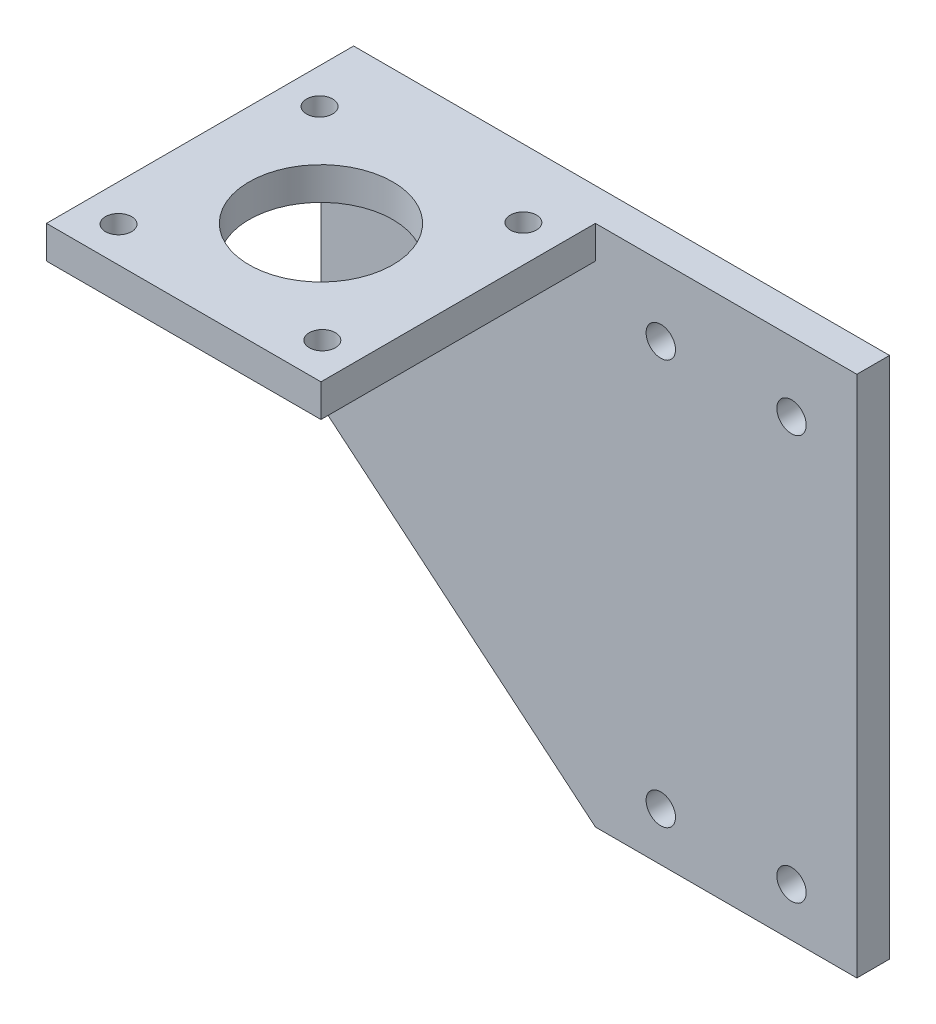
ISO-10303-21;
HEADER;
FILE_DESCRIPTION(('STEP AP214'),'2;1');
FILE_NAME('part.step','',(''),(''),'','','');
FILE_SCHEMA(('AUTOMOTIVE_DESIGN { 1 0 10303 214 1 1 1 1 }'));
ENDSEC;
DATA;
#1=APPLICATION_CONTEXT('core data for automotive mechanical design processes');
#2=APPLICATION_PROTOCOL_DEFINITION('international standard','automotive_design',2000,#1);
#3=PRODUCT_CONTEXT('',#1,'mechanical');
#4=PRODUCT('Part','Part','',(#3));
#5=PRODUCT_RELATED_PRODUCT_CATEGORY('part','',(#4));
#6=PRODUCT_DEFINITION_FORMATION('','',#4);
#7=PRODUCT_DEFINITION_CONTEXT('part definition',#1,'design');
#8=PRODUCT_DEFINITION('design','',#6,#7);
#9=PRODUCT_DEFINITION_SHAPE('','',#8);
#10=(LENGTH_UNIT() NAMED_UNIT(*) SI_UNIT(.MILLI.,.METRE.));
#11=(NAMED_UNIT(*) PLANE_ANGLE_UNIT() SI_UNIT($,.RADIAN.));
#12=(NAMED_UNIT(*) SI_UNIT($,.STERADIAN.) SOLID_ANGLE_UNIT());
#13=UNCERTAINTY_MEASURE_WITH_UNIT(LENGTH_MEASURE(1.E-05),#10,'distance_accuracy_value','');
#14=(GEOMETRIC_REPRESENTATION_CONTEXT(3) GLOBAL_UNCERTAINTY_ASSIGNED_CONTEXT((#13)) GLOBAL_UNIT_ASSIGNED_CONTEXT((#10,
#11,#12)) REPRESENTATION_CONTEXT('',''));
#15=CARTESIAN_POINT('',(0.,0.,0.));
#16=DIRECTION('',(0.,0.,1.));
#17=DIRECTION('',(1.,0.,0.));
#18=AXIS2_PLACEMENT_3D('',#15,#16,#17);
#19=CARTESIAN_POINT('',(0.,5.,-42.));
#20=DIRECTION('',(0.,-1.,0.));
#21=DIRECTION('',(0.,0.,1.));
#22=AXIS2_PLACEMENT_3D('',#19,#20,#21);
#23=PLANE('',#22);
#24=DIRECTION('',(0.,0.,1.));
#25=VECTOR('',#24,1.);
#26=CARTESIAN_POINT('',(21.,5.,-63.));
#27=LINE('',#26,#25);
#28=CARTESIAN_POINT('',(21.,5.,-63.));
#29=VERTEX_POINT('',#28);
#30=CARTESIAN_POINT('',(21.,5.,-21.));
#31=VERTEX_POINT('',#30);
#32=EDGE_CURVE('E91',#29,#31,#27,.T.);
#33=ORIENTED_EDGE('',*,*,#32,.F.);
#34=DIRECTION('',(-1.,0.,0.));
#35=VECTOR('',#34,1.);
#36=CARTESIAN_POINT('',(21.,5.,-63.));
#37=LINE('',#36,#35);
#38=CARTESIAN_POINT('',(61.,5.,-63.));
#39=VERTEX_POINT('',#38);
#40=EDGE_CURVE('E77',#39,#29,#37,.T.);
#41=ORIENTED_EDGE('',*,*,#40,.F.);
#42=DIRECTION('',(0.,0.,1.));
#43=VECTOR('',#42,1.);
#44=CARTESIAN_POINT('',(61.,5.,-68.));
#45=LINE('',#44,#43);
#46=CARTESIAN_POINT('',(61.,5.,-68.));
#47=VERTEX_POINT('',#46);
#48=EDGE_CURVE('E141',#47,#39,#45,.T.);
#49=ORIENTED_EDGE('',*,*,#48,.F.);
#50=DIRECTION('',(-1.,0.,0.));
#51=VECTOR('',#50,1.);
#52=CARTESIAN_POINT('',(-21.,5.,-68.));
#53=LINE('',#52,#51);
#54=CARTESIAN_POINT('',(-21.,5.,-68.));
#55=VERTEX_POINT('',#54);
#56=EDGE_CURVE('E146',#47,#55,#53,.T.);
#57=ORIENTED_EDGE('',*,*,#56,.T.);
#58=DIRECTION('',(0.,0.,-1.));
#59=VECTOR('',#58,1.);
#60=CARTESIAN_POINT('',(-21.,5.,-63.));
#61=LINE('',#60,#59);
#62=CARTESIAN_POINT('',(-21.,5.,-21.));
#63=VERTEX_POINT('',#62);
#64=EDGE_CURVE('E82',#63,#55,#61,.T.);
#65=ORIENTED_EDGE('',*,*,#64,.F.);
#66=DIRECTION('',(-1.,0.,0.));
#67=VECTOR('',#66,1.);
#68=CARTESIAN_POINT('',(-21.,5.,-21.));
#69=LINE('',#68,#67);
#70=EDGE_CURVE('E103',#31,#63,#69,.T.);
#71=ORIENTED_EDGE('',*,*,#70,.F.);
#72=EDGE_LOOP('',(#33,#41,#49,#57,#65,#71));
#73=FACE_BOUND('',#72,.T.);
#74=CARTESIAN_POINT('',(0.,5.,-42.));
#75=DIRECTION('',(0.,-1.,0.));
#76=DIRECTION('',(0.,0.,-1.));
#77=AXIS2_PLACEMENT_3D('',#74,#75,#76);
#78=CIRCLE('',#77,11.);
#79=CARTESIAN_POINT('',(0.,5.,-53.));
#80=VERTEX_POINT('',#79);
#81=EDGE_CURVE('E94',#80,#80,#78,.T.);
#82=ORIENTED_EDGE('',*,*,#81,.T.);
#83=EDGE_LOOP('',(#82));
#84=FACE_BOUND('',#83,.T.);
#85=CARTESIAN_POINT('',(-15.592519129157,5.,-57.3780150606921));
#86=DIRECTION('',(0.,-1.,0.));
#87=DIRECTION('',(0.,0.,-1.));
#88=AXIS2_PLACEMENT_3D('',#85,#86,#87);
#89=CIRCLE('',#88,2.);
#90=CARTESIAN_POINT('',(-15.592519129157,5.,-59.3780150606921));
#91=VERTEX_POINT('',#90);
#92=EDGE_CURVE('E107',#91,#91,#89,.T.);
#93=ORIENTED_EDGE('',*,*,#92,.T.);
#94=EDGE_LOOP('',(#93));
#95=FACE_BOUND('',#94,.T.);
#96=CARTESIAN_POINT('',(-15.3780150606921,5.,-26.407480870843));
#97=DIRECTION('',(0.,-1.,0.));
#98=DIRECTION('',(0.,0.,-1.));
#99=AXIS2_PLACEMENT_3D('',#96,#97,#98);
#100=CIRCLE('',#99,2.);
#101=CARTESIAN_POINT('',(-15.3780150606921,5.,-28.407480870843));
#102=VERTEX_POINT('',#101);
#103=EDGE_CURVE('E112',#102,#102,#100,.T.);
#104=ORIENTED_EDGE('',*,*,#103,.T.);
#105=EDGE_LOOP('',(#104));
#106=FACE_BOUND('',#105,.T.);
#107=CARTESIAN_POINT('',(15.592519129157,5.,-26.6219849393079));
#108=DIRECTION('',(0.,-1.,0.));
#109=DIRECTION('',(0.,0.,-1.));
#110=AXIS2_PLACEMENT_3D('',#107,#108,#109);
#111=CIRCLE('',#110,2.);
#112=CARTESIAN_POINT('',(15.592519129157,5.,-28.6219849393079));
#113=VERTEX_POINT('',#112);
#114=EDGE_CURVE('E118',#113,#113,#111,.T.);
#115=ORIENTED_EDGE('',*,*,#114,.T.);
#116=EDGE_LOOP('',(#115));
#117=FACE_BOUND('',#116,.T.);
#118=CARTESIAN_POINT('',(15.3780150606921,5.,-57.592519129157));
#119=DIRECTION('',(0.,-1.,0.));
#120=DIRECTION('',(0.,0.,-1.));
#121=AXIS2_PLACEMENT_3D('',#118,#119,#120);
#122=CIRCLE('',#121,2.);
#123=CARTESIAN_POINT('',(15.3780150606921,5.,-59.592519129157));
#124=VERTEX_POINT('',#123);
#125=EDGE_CURVE('E124',#124,#124,#122,.T.);
#126=ORIENTED_EDGE('',*,*,#125,.T.);
#127=EDGE_LOOP('',(#126));
#128=FACE_BOUND('',#127,.T.);
#129=ADVANCED_FACE('F35',(#73,#84,#95,#106,#117,#128),#23,.F.);
#130=CARTESIAN_POINT('',(0.,0.,-42.));
#131=DIRECTION('',(0.,-1.,0.));
#132=DIRECTION('',(0.,0.,1.));
#133=AXIS2_PLACEMENT_3D('',#130,#131,#132);
#134=PLANE('',#133);
#135=CARTESIAN_POINT('',(15.592519129157,0.,-26.6219849393079));
#136=DIRECTION('',(0.,-1.,0.));
#137=DIRECTION('',(0.,0.,-1.));
#138=AXIS2_PLACEMENT_3D('',#135,#136,#137);
#139=CIRCLE('',#138,2.);
#140=CARTESIAN_POINT('',(15.592519129157,0.,-28.6219849393079));
#141=VERTEX_POINT('',#140);
#142=EDGE_CURVE('E121',#141,#141,#139,.T.);
#143=ORIENTED_EDGE('',*,*,#142,.F.);
#144=EDGE_LOOP('',(#143));
#145=FACE_BOUND('',#144,.T.);
#146=CARTESIAN_POINT('',(-15.592519129157,0.,-57.3780150606921));
#147=DIRECTION('',(0.,-1.,0.));
#148=DIRECTION('',(0.,0.,-1.));
#149=AXIS2_PLACEMENT_3D('',#146,#147,#148);
#150=CIRCLE('',#149,2.);
#151=CARTESIAN_POINT('',(-15.592519129157,0.,-59.3780150606921));
#152=VERTEX_POINT('',#151);
#153=EDGE_CURVE('E109',#152,#152,#150,.T.);
#154=ORIENTED_EDGE('',*,*,#153,.F.);
#155=EDGE_LOOP('',(#154));
#156=FACE_BOUND('',#155,.T.);
#157=DIRECTION('',(0.,0.,1.));
#158=VECTOR('',#157,1.);
#159=CARTESIAN_POINT('',(21.,0.,-63.));
#160=LINE('',#159,#158);
#161=CARTESIAN_POINT('',(21.,0.,-63.));
#162=VERTEX_POINT('',#161);
#163=CARTESIAN_POINT('',(21.,0.,-21.));
#164=VERTEX_POINT('',#163);
#165=EDGE_CURVE('E89',#162,#164,#160,.T.);
#166=ORIENTED_EDGE('',*,*,#165,.T.);
#167=DIRECTION('',(-1.,0.,0.));
#168=VECTOR('',#167,1.);
#169=CARTESIAN_POINT('',(-21.,0.,-21.));
#170=LINE('',#169,#168);
#171=CARTESIAN_POINT('',(-21.,0.,-21.));
#172=VERTEX_POINT('',#171);
#173=EDGE_CURVE('E93',#164,#172,#170,.T.);
#174=ORIENTED_EDGE('',*,*,#173,.T.);
#175=DIRECTION('',(0.,0.,-1.));
#176=VECTOR('',#175,1.);
#177=CARTESIAN_POINT('',(-21.,0.,-63.));
#178=LINE('',#177,#176);
#179=CARTESIAN_POINT('',(-21.,0.,-63.));
#180=VERTEX_POINT('',#179);
#181=EDGE_CURVE('E90',#172,#180,#178,.T.);
#182=ORIENTED_EDGE('',*,*,#181,.T.);
#183=DIRECTION('',(1.,0.,0.));
#184=VECTOR('',#183,1.);
#185=CARTESIAN_POINT('',(-21.,0.,-63.));
#186=LINE('',#185,#184);
#187=EDGE_CURVE('E73',#180,#162,#186,.T.);
#188=ORIENTED_EDGE('',*,*,#187,.T.);
#189=EDGE_LOOP('',(#166,#174,#182,#188));
#190=FACE_BOUND('',#189,.T.);
#191=CARTESIAN_POINT('',(0.,0.,-42.));
#192=DIRECTION('',(0.,-1.,0.));
#193=DIRECTION('',(0.,0.,-1.));
#194=AXIS2_PLACEMENT_3D('',#191,#192,#193);
#195=CIRCLE('',#194,11.);
#196=CARTESIAN_POINT('',(0.,0.,-53.));
#197=VERTEX_POINT('',#196);
#198=EDGE_CURVE('E98',#197,#197,#195,.T.);
#199=ORIENTED_EDGE('',*,*,#198,.F.);
#200=EDGE_LOOP('',(#199));
#201=FACE_BOUND('',#200,.T.);
#202=CARTESIAN_POINT('',(-15.3780150606921,0.,-26.407480870843));
#203=DIRECTION('',(0.,-1.,0.));
#204=DIRECTION('',(0.,0.,-1.));
#205=AXIS2_PLACEMENT_3D('',#202,#203,#204);
#206=CIRCLE('',#205,2.);
#207=CARTESIAN_POINT('',(-15.3780150606921,0.,-28.407480870843));
#208=VERTEX_POINT('',#207);
#209=EDGE_CURVE('E115',#208,#208,#206,.T.);
#210=ORIENTED_EDGE('',*,*,#209,.F.);
#211=EDGE_LOOP('',(#210));
#212=FACE_BOUND('',#211,.T.);
#213=CARTESIAN_POINT('',(15.3780150606921,0.,-57.592519129157));
#214=DIRECTION('',(0.,-1.,0.));
#215=DIRECTION('',(0.,0.,-1.));
#216=AXIS2_PLACEMENT_3D('',#213,#214,#215);
#217=CIRCLE('',#216,2.);
#218=CARTESIAN_POINT('',(15.3780150606921,0.,-59.592519129157));
#219=VERTEX_POINT('',#218);
#220=EDGE_CURVE('E127',#219,#219,#217,.T.);
#221=ORIENTED_EDGE('',*,*,#220,.F.);
#222=EDGE_LOOP('',(#221));
#223=FACE_BOUND('',#222,.T.);
#224=ADVANCED_FACE('F86',(#145,#156,#190,#201,#212,#223),#134,.T.);
#225=CARTESIAN_POINT('',(21.,5.,-63.));
#226=DIRECTION('',(-1.,0.,0.));
#227=DIRECTION('',(0.,0.,-1.));
#228=AXIS2_PLACEMENT_3D('',#225,#226,#227);
#229=PLANE('',#228);
#230=ORIENTED_EDGE('',*,*,#165,.F.);
#231=DIRECTION('',(0.,-1.,0.));
#232=VECTOR('',#231,1.);
#233=CARTESIAN_POINT('',(21.,5.,-63.));
#234=LINE('',#233,#232);
#235=EDGE_CURVE('E67',#29,#162,#234,.T.);
#236=ORIENTED_EDGE('',*,*,#235,.F.);
#237=ORIENTED_EDGE('',*,*,#32,.T.);
#238=DIRECTION('',(0.,-1.,0.));
#239=VECTOR('',#238,1.);
#240=CARTESIAN_POINT('',(21.,5.,-21.));
#241=LINE('',#240,#239);
#242=EDGE_CURVE('E11',#31,#164,#241,.T.);
#243=ORIENTED_EDGE('',*,*,#242,.T.);
#244=EDGE_LOOP('',(#230,#236,#237,#243));
#245=FACE_BOUND('',#244,.T.);
#246=ADVANCED_FACE('F37',(#245),#229,.F.);
#247=CARTESIAN_POINT('',(-21.,5.,-21.));
#248=DIRECTION('',(0.,0.,-1.));
#249=DIRECTION('',(1.,0.,0.));
#250=AXIS2_PLACEMENT_3D('',#247,#248,#249);
#251=PLANE('',#250);
#252=ORIENTED_EDGE('',*,*,#173,.F.);
#253=ORIENTED_EDGE('',*,*,#242,.F.);
#254=ORIENTED_EDGE('',*,*,#70,.T.);
#255=DIRECTION('',(0.,-1.,0.));
#256=VECTOR('',#255,1.);
#257=CARTESIAN_POINT('',(-21.,5.,-21.));
#258=LINE('',#257,#256);
#259=EDGE_CURVE('E44',#63,#172,#258,.T.);
#260=ORIENTED_EDGE('',*,*,#259,.T.);
#261=EDGE_LOOP('',(#252,#253,#254,#260));
#262=FACE_BOUND('',#261,.T.);
#263=ADVANCED_FACE('F236',(#262),#251,.F.);
#264=CARTESIAN_POINT('',(-21.,5.,-63.));
#265=DIRECTION('',(1.,0.,0.));
#266=DIRECTION('',(0.,0.,1.));
#267=AXIS2_PLACEMENT_3D('',#264,#265,#266);
#268=PLANE('',#267);
#269=ORIENTED_EDGE('',*,*,#181,.F.);
#270=ORIENTED_EDGE('',*,*,#259,.F.);
#271=ORIENTED_EDGE('',*,*,#64,.T.);
#272=DIRECTION('',(0.,-1.,0.));
#273=VECTOR('',#272,1.);
#274=CARTESIAN_POINT('',(-21.,0.,-68.));
#275=LINE('',#274,#273);
#276=CARTESIAN_POINT('',(-21.,-40.,-68.));
#277=VERTEX_POINT('',#276);
#278=EDGE_CURVE('E166',#55,#277,#275,.T.);
#279=ORIENTED_EDGE('',*,*,#278,.T.);
#280=DIRECTION('',(0.,0.,1.));
#281=VECTOR('',#280,1.);
#282=CARTESIAN_POINT('',(-21.,-40.,-68.));
#283=LINE('',#282,#281);
#284=CARTESIAN_POINT('',(-21.,-40.,-63.));
#285=VERTEX_POINT('',#284);
#286=EDGE_CURVE('E130',#277,#285,#283,.T.);
#287=ORIENTED_EDGE('',*,*,#286,.T.);
#288=DIRECTION('',(0.,-1.,0.));
#289=VECTOR('',#288,1.);
#290=CARTESIAN_POINT('',(-21.,0.,-63.));
#291=LINE('',#290,#289);
#292=EDGE_CURVE('E155',#180,#285,#291,.T.);
#293=ORIENTED_EDGE('',*,*,#292,.F.);
#294=EDGE_LOOP('',(#269,#270,#271,#279,#287,#293));
#295=FACE_BOUND('',#294,.T.);
#296=ADVANCED_FACE('F234',(#295),#268,.F.);
#297=CARTESIAN_POINT('',(0.,5.,-42.));
#298=DIRECTION('',(0.,-1.,0.));
#299=DIRECTION('',(0.,0.,1.));
#300=AXIS2_PLACEMENT_3D('',#297,#298,#299);
#301=CYLINDRICAL_SURFACE('',#300,11.);
#302=ORIENTED_EDGE('',*,*,#81,.F.);
#303=EDGE_LOOP('',(#302));
#304=FACE_BOUND('',#303,.T.);
#305=ORIENTED_EDGE('',*,*,#198,.T.);
#306=EDGE_LOOP('',(#305));
#307=FACE_BOUND('',#306,.T.);
#308=ADVANCED_FACE('F231',(#304,#307),#301,.F.);
#309=CARTESIAN_POINT('',(-15.592519129157,5.,-57.3780150606921));
#310=DIRECTION('',(0.,-1.,0.));
#311=DIRECTION('',(0.,0.,1.));
#312=AXIS2_PLACEMENT_3D('',#309,#310,#311);
#313=CYLINDRICAL_SURFACE('',#312,2.);
#314=ORIENTED_EDGE('',*,*,#92,.F.);
#315=EDGE_LOOP('',(#314));
#316=FACE_BOUND('',#315,.T.);
#317=ORIENTED_EDGE('',*,*,#153,.T.);
#318=EDGE_LOOP('',(#317));
#319=FACE_BOUND('',#318,.T.);
#320=ADVANCED_FACE('F317',(#316,#319),#313,.F.);
#321=CARTESIAN_POINT('',(-15.3780150606921,5.,-26.407480870843));
#322=DIRECTION('',(0.,-1.,0.));
#323=DIRECTION('',(0.,0.,1.));
#324=AXIS2_PLACEMENT_3D('',#321,#322,#323);
#325=CYLINDRICAL_SURFACE('',#324,2.);
#326=ORIENTED_EDGE('',*,*,#103,.F.);
#327=EDGE_LOOP('',(#326));
#328=FACE_BOUND('',#327,.T.);
#329=ORIENTED_EDGE('',*,*,#209,.T.);
#330=EDGE_LOOP('',(#329));
#331=FACE_BOUND('',#330,.T.);
#332=ADVANCED_FACE('F314',(#328,#331),#325,.F.);
#333=CARTESIAN_POINT('',(15.592519129157,5.,-26.6219849393079));
#334=DIRECTION('',(0.,-1.,0.));
#335=DIRECTION('',(0.,0.,1.));
#336=AXIS2_PLACEMENT_3D('',#333,#334,#335);
#337=CYLINDRICAL_SURFACE('',#336,2.);
#338=ORIENTED_EDGE('',*,*,#114,.F.);
#339=EDGE_LOOP('',(#338));
#340=FACE_BOUND('',#339,.T.);
#341=ORIENTED_EDGE('',*,*,#142,.T.);
#342=EDGE_LOOP('',(#341));
#343=FACE_BOUND('',#342,.T.);
#344=ADVANCED_FACE('F310',(#340,#343),#337,.F.);
#345=CARTESIAN_POINT('',(15.3780150606921,5.,-57.592519129157));
#346=DIRECTION('',(0.,-1.,0.));
#347=DIRECTION('',(0.,0.,1.));
#348=AXIS2_PLACEMENT_3D('',#345,#346,#347);
#349=CYLINDRICAL_SURFACE('',#348,2.);
#350=ORIENTED_EDGE('',*,*,#125,.F.);
#351=EDGE_LOOP('',(#350));
#352=FACE_BOUND('',#351,.T.);
#353=ORIENTED_EDGE('',*,*,#220,.T.);
#354=EDGE_LOOP('',(#353));
#355=FACE_BOUND('',#354,.T.);
#356=ADVANCED_FACE('F215',(#352,#355),#349,.F.);
#357=CARTESIAN_POINT('',(0.,0.,-68.));
#358=DIRECTION('',(0.,0.,1.));
#359=DIRECTION('',(-1.,0.,0.));
#360=AXIS2_PLACEMENT_3D('',#357,#358,#359);
#361=PLANE('',#360);
#362=ORIENTED_EDGE('',*,*,#56,.F.);
#363=DIRECTION('',(0.,1.,0.));
#364=VECTOR('',#363,1.);
#365=CARTESIAN_POINT('',(61.,5.,-68.));
#366=LINE('',#365,#364);
#367=CARTESIAN_POINT('',(61.,-75.,-68.));
#368=VERTEX_POINT('',#367);
#369=EDGE_CURVE('E144',#368,#47,#366,.T.);
#370=ORIENTED_EDGE('',*,*,#369,.F.);
#371=DIRECTION('',(1.,0.,0.));
#372=VECTOR('',#371,1.);
#373=CARTESIAN_POINT('',(61.,-75.,-68.));
#374=LINE('',#373,#372);
#375=CARTESIAN_POINT('',(21.,-75.,-68.));
#376=VERTEX_POINT('',#375);
#377=EDGE_CURVE('E160',#376,#368,#374,.T.);
#378=ORIENTED_EDGE('',*,*,#377,.F.);
#379=DIRECTION('',(0.768221279597376,-0.64018439966448,0.));
#380=VECTOR('',#379,1.);
#381=CARTESIAN_POINT('',(-21.,-40.,-68.));
#382=LINE('',#381,#380);
#383=EDGE_CURVE('E163',#277,#376,#382,.T.);
#384=ORIENTED_EDGE('',*,*,#383,.F.);
#385=ORIENTED_EDGE('',*,*,#278,.F.);
#386=EDGE_LOOP('',(#362,#370,#378,#384,#385));
#387=FACE_BOUND('',#386,.T.);
#388=CARTESIAN_POINT('',(51.,-67.5818456079327,-68.));
#389=DIRECTION('',(0.,0.,1.));
#390=DIRECTION('',(1.,0.,0.));
#391=AXIS2_PLACEMENT_3D('',#388,#389,#390);
#392=CIRCLE('',#391,2.25);
#393=CARTESIAN_POINT('',(53.25,-67.5818456079327,-68.));
#394=VERTEX_POINT('',#393);
#395=EDGE_CURVE('E157',#394,#394,#392,.T.);
#396=ORIENTED_EDGE('',*,*,#395,.T.);
#397=EDGE_LOOP('',(#396));
#398=FACE_BOUND('',#397,.T.);
#399=CARTESIAN_POINT('',(31.,-67.5818456079327,-68.));
#400=DIRECTION('',(0.,0.,1.));
#401=DIRECTION('',(1.,0.,0.));
#402=AXIS2_PLACEMENT_3D('',#399,#400,#401);
#403=CIRCLE('',#402,2.25);
#404=CARTESIAN_POINT('',(33.25,-67.5818456079327,-68.));
#405=VERTEX_POINT('',#404);
#406=EDGE_CURVE('E174',#405,#405,#403,.T.);
#407=ORIENTED_EDGE('',*,*,#406,.T.);
#408=EDGE_LOOP('',(#407));
#409=FACE_BOUND('',#408,.T.);
#410=CARTESIAN_POINT('',(31.,-5.62734865596326,-68.));
#411=DIRECTION('',(0.,0.,1.));
#412=DIRECTION('',(1.,0.,0.));
#413=AXIS2_PLACEMENT_3D('',#410,#411,#412);
#414=CIRCLE('',#413,2.25);
#415=CARTESIAN_POINT('',(33.25,-5.62734865596326,-68.));
#416=VERTEX_POINT('',#415);
#417=EDGE_CURVE('E180',#416,#416,#414,.T.);
#418=ORIENTED_EDGE('',*,*,#417,.T.);
#419=EDGE_LOOP('',(#418));
#420=FACE_BOUND('',#419,.T.);
#421=CARTESIAN_POINT('',(51.,-5.62734865596326,-68.));
#422=DIRECTION('',(0.,0.,1.));
#423=DIRECTION('',(1.,0.,0.));
#424=AXIS2_PLACEMENT_3D('',#421,#422,#423);
#425=CIRCLE('',#424,2.25);
#426=CARTESIAN_POINT('',(53.25,-5.62734865596326,-68.));
#427=VERTEX_POINT('',#426);
#428=EDGE_CURVE('E186',#427,#427,#425,.T.);
#429=ORIENTED_EDGE('',*,*,#428,.T.);
#430=EDGE_LOOP('',(#429));
#431=FACE_BOUND('',#430,.T.);
#432=ADVANCED_FACE('F195',(#387,#398,#409,#420,#431),#361,.F.);
#433=CARTESIAN_POINT('',(0.,0.,-63.));
#434=DIRECTION('',(0.,0.,1.));
#435=DIRECTION('',(-1.,0.,0.));
#436=AXIS2_PLACEMENT_3D('',#433,#434,#435);
#437=PLANE('',#436);
#438=CARTESIAN_POINT('',(31.,-5.62734865596326,-63.));
#439=DIRECTION('',(0.,0.,1.));
#440=DIRECTION('',(1.,0.,0.));
#441=AXIS2_PLACEMENT_3D('',#438,#439,#440);
#442=CIRCLE('',#441,2.25);
#443=CARTESIAN_POINT('',(33.25,-5.62734865596326,-63.));
#444=VERTEX_POINT('',#443);
#445=EDGE_CURVE('E183',#444,#444,#442,.T.);
#446=ORIENTED_EDGE('',*,*,#445,.F.);
#447=EDGE_LOOP('',(#446));
#448=FACE_BOUND('',#447,.T.);
#449=CARTESIAN_POINT('',(51.,-67.5818456079327,-63.));
#450=DIRECTION('',(0.,0.,1.));
#451=DIRECTION('',(1.,0.,0.));
#452=AXIS2_PLACEMENT_3D('',#449,#450,#451);
#453=CIRCLE('',#452,2.25);
#454=CARTESIAN_POINT('',(53.25,-67.5818456079327,-63.));
#455=VERTEX_POINT('',#454);
#456=EDGE_CURVE('E171',#455,#455,#453,.T.);
#457=ORIENTED_EDGE('',*,*,#456,.F.);
#458=EDGE_LOOP('',(#457));
#459=FACE_BOUND('',#458,.T.);
#460=ORIENTED_EDGE('',*,*,#292,.T.);
#461=DIRECTION('',(0.768221279597376,-0.64018439966448,0.));
#462=VECTOR('',#461,1.);
#463=CARTESIAN_POINT('',(-21.,-40.,-63.));
#464=LINE('',#463,#462);
#465=CARTESIAN_POINT('',(21.,-75.,-63.));
#466=VERTEX_POINT('',#465);
#467=EDGE_CURVE('E152',#285,#466,#464,.T.);
#468=ORIENTED_EDGE('',*,*,#467,.T.);
#469=DIRECTION('',(1.,0.,0.));
#470=VECTOR('',#469,1.);
#471=CARTESIAN_POINT('',(61.,-75.,-63.));
#472=LINE('',#471,#470);
#473=CARTESIAN_POINT('',(61.,-75.,-63.));
#474=VERTEX_POINT('',#473);
#475=EDGE_CURVE('E149',#466,#474,#472,.T.);
#476=ORIENTED_EDGE('',*,*,#475,.T.);
#477=DIRECTION('',(0.,1.,0.));
#478=VECTOR('',#477,1.);
#479=CARTESIAN_POINT('',(61.,5.,-63.));
#480=LINE('',#479,#478);
#481=EDGE_CURVE('E147',#474,#39,#480,.T.);
#482=ORIENTED_EDGE('',*,*,#481,.T.);
#483=ORIENTED_EDGE('',*,*,#40,.T.);
#484=ORIENTED_EDGE('',*,*,#235,.T.);
#485=ORIENTED_EDGE('',*,*,#187,.F.);
#486=EDGE_LOOP('',(#460,#468,#476,#482,#483,#484,#485));
#487=FACE_BOUND('',#486,.T.);
#488=CARTESIAN_POINT('',(31.,-67.5818456079327,-63.));
#489=DIRECTION('',(0.,0.,1.));
#490=DIRECTION('',(1.,0.,0.));
#491=AXIS2_PLACEMENT_3D('',#488,#489,#490);
#492=CIRCLE('',#491,2.25);
#493=CARTESIAN_POINT('',(33.25,-67.5818456079327,-63.));
#494=VERTEX_POINT('',#493);
#495=EDGE_CURVE('E177',#494,#494,#492,.T.);
#496=ORIENTED_EDGE('',*,*,#495,.F.);
#497=EDGE_LOOP('',(#496));
#498=FACE_BOUND('',#497,.T.);
#499=CARTESIAN_POINT('',(51.,-5.62734865596326,-63.));
#500=DIRECTION('',(0.,0.,1.));
#501=DIRECTION('',(1.,0.,0.));
#502=AXIS2_PLACEMENT_3D('',#499,#500,#501);
#503=CIRCLE('',#502,2.25);
#504=CARTESIAN_POINT('',(53.25,-5.62734865596326,-63.));
#505=VERTEX_POINT('',#504);
#506=EDGE_CURVE('E189',#505,#505,#503,.T.);
#507=ORIENTED_EDGE('',*,*,#506,.F.);
#508=EDGE_LOOP('',(#507));
#509=FACE_BOUND('',#508,.T.);
#510=ADVANCED_FACE('F70',(#448,#459,#487,#498,#509),#437,.T.);
#511=CARTESIAN_POINT('',(-21.,-40.,-68.));
#512=DIRECTION('',(0.64018439966448,0.768221279597376,0.));
#513=DIRECTION('',(-0.768221279597376,0.64018439966448,0.));
#514=AXIS2_PLACEMENT_3D('',#511,#512,#513);
#515=PLANE('',#514);
#516=ORIENTED_EDGE('',*,*,#467,.F.);
#517=ORIENTED_EDGE('',*,*,#286,.F.);
#518=ORIENTED_EDGE('',*,*,#383,.T.);
#519=DIRECTION('',(0.,0.,1.));
#520=VECTOR('',#519,1.);
#521=CARTESIAN_POINT('',(21.,-75.,-68.));
#522=LINE('',#521,#520);
#523=EDGE_CURVE('E135',#376,#466,#522,.T.);
#524=ORIENTED_EDGE('',*,*,#523,.T.);
#525=EDGE_LOOP('',(#516,#517,#518,#524));
#526=FACE_BOUND('',#525,.T.);
#527=ADVANCED_FACE('F205',(#526),#515,.F.);
#528=CARTESIAN_POINT('',(61.,-75.,-68.));
#529=DIRECTION('',(0.,1.,0.));
#530=DIRECTION('',(-1.,0.,0.));
#531=AXIS2_PLACEMENT_3D('',#528,#529,#530);
#532=PLANE('',#531);
#533=ORIENTED_EDGE('',*,*,#475,.F.);
#534=ORIENTED_EDGE('',*,*,#523,.F.);
#535=ORIENTED_EDGE('',*,*,#377,.T.);
#536=DIRECTION('',(0.,0.,1.));
#537=VECTOR('',#536,1.);
#538=CARTESIAN_POINT('',(61.,-75.,-68.));
#539=LINE('',#538,#537);
#540=EDGE_CURVE('E138',#368,#474,#539,.T.);
#541=ORIENTED_EDGE('',*,*,#540,.T.);
#542=EDGE_LOOP('',(#533,#534,#535,#541));
#543=FACE_BOUND('',#542,.T.);
#544=ADVANCED_FACE('F212',(#543),#532,.F.);
#545=CARTESIAN_POINT('',(61.,5.,-68.));
#546=DIRECTION('',(-1.,0.,0.));
#547=DIRECTION('',(0.,-1.,0.));
#548=AXIS2_PLACEMENT_3D('',#545,#546,#547);
#549=PLANE('',#548);
#550=ORIENTED_EDGE('',*,*,#481,.F.);
#551=ORIENTED_EDGE('',*,*,#540,.F.);
#552=ORIENTED_EDGE('',*,*,#369,.T.);
#553=ORIENTED_EDGE('',*,*,#48,.T.);
#554=EDGE_LOOP('',(#550,#551,#552,#553));
#555=FACE_BOUND('',#554,.T.);
#556=ADVANCED_FACE('F277',(#555),#549,.F.);
#557=CARTESIAN_POINT('',(51.,-67.5818456079327,-68.));
#558=DIRECTION('',(0.,0.,1.));
#559=DIRECTION('',(-1.,0.,0.));
#560=AXIS2_PLACEMENT_3D('',#557,#558,#559);
#561=CYLINDRICAL_SURFACE('',#560,2.25);
#562=ORIENTED_EDGE('',*,*,#395,.F.);
#563=EDGE_LOOP('',(#562));
#564=FACE_BOUND('',#563,.T.);
#565=ORIENTED_EDGE('',*,*,#456,.T.);
#566=EDGE_LOOP('',(#565));
#567=FACE_BOUND('',#566,.T.);
#568=ADVANCED_FACE('F292',(#564,#567),#561,.F.);
#569=CARTESIAN_POINT('',(31.,-67.5818456079327,-68.));
#570=DIRECTION('',(0.,0.,1.));
#571=DIRECTION('',(-1.,0.,0.));
#572=AXIS2_PLACEMENT_3D('',#569,#570,#571);
#573=CYLINDRICAL_SURFACE('',#572,2.25);
#574=ORIENTED_EDGE('',*,*,#406,.F.);
#575=EDGE_LOOP('',(#574));
#576=FACE_BOUND('',#575,.T.);
#577=ORIENTED_EDGE('',*,*,#495,.T.);
#578=EDGE_LOOP('',(#577));
#579=FACE_BOUND('',#578,.T.);
#580=ADVANCED_FACE('F287',(#576,#579),#573,.F.);
#581=CARTESIAN_POINT('',(31.,-5.62734865596326,-68.));
#582=DIRECTION('',(0.,0.,1.));
#583=DIRECTION('',(-1.,0.,0.));
#584=AXIS2_PLACEMENT_3D('',#581,#582,#583);
#585=CYLINDRICAL_SURFACE('',#584,2.25);
#586=ORIENTED_EDGE('',*,*,#417,.F.);
#587=EDGE_LOOP('',(#586));
#588=FACE_BOUND('',#587,.T.);
#589=ORIENTED_EDGE('',*,*,#445,.T.);
#590=EDGE_LOOP('',(#589));
#591=FACE_BOUND('',#590,.T.);
#592=ADVANCED_FACE('F200',(#588,#591),#585,.F.);
#593=CARTESIAN_POINT('',(51.,-5.62734865596326,-68.));
#594=DIRECTION('',(0.,0.,1.));
#595=DIRECTION('',(-1.,0.,0.));
#596=AXIS2_PLACEMENT_3D('',#593,#594,#595);
#597=CYLINDRICAL_SURFACE('',#596,2.25);
#598=ORIENTED_EDGE('',*,*,#428,.F.);
#599=EDGE_LOOP('',(#598));
#600=FACE_BOUND('',#599,.T.);
#601=ORIENTED_EDGE('',*,*,#506,.T.);
#602=EDGE_LOOP('',(#601));
#603=FACE_BOUND('',#602,.T.);
#604=ADVANCED_FACE('F197',(#600,#603),#597,.F.);
#605=CLOSED_SHELL('',(#129,#224,#246,#263,#296,#308,#320,#332,#344,#356,#432,#510,#527,#544,
#556,#568,#580,#592,#604));
#606=MANIFOLD_SOLID_BREP('B2',#605);
#607=ADVANCED_BREP_SHAPE_REPRESENTATION('',(#18,#606),#14);
#608=SHAPE_DEFINITION_REPRESENTATION(#9,#607);
ENDSEC;
END-ISO-10303-21;
